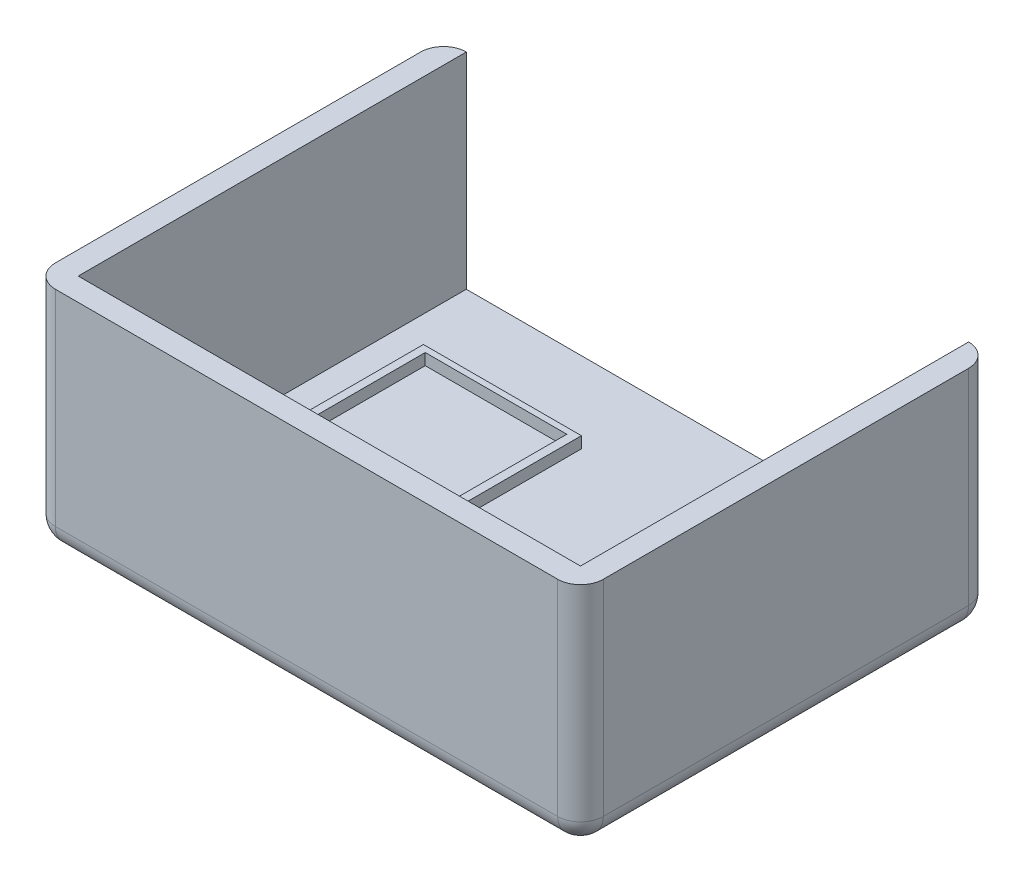
ISO-10303-21;
HEADER;
FILE_DESCRIPTION(('STEP AP214'),'2;1');
FILE_NAME('part.step','',(''),(''),'','','');
FILE_SCHEMA(('AUTOMOTIVE_DESIGN { 1 0 10303 214 1 1 1 1 }'));
ENDSEC;
DATA;
#1=APPLICATION_CONTEXT('core data for automotive mechanical design processes');
#2=APPLICATION_PROTOCOL_DEFINITION('international standard','automotive_design',2000,#1);
#3=PRODUCT_CONTEXT('',#1,'mechanical');
#4=PRODUCT('Part','Part','',(#3));
#5=PRODUCT_RELATED_PRODUCT_CATEGORY('part','',(#4));
#6=PRODUCT_DEFINITION_FORMATION('','',#4);
#7=PRODUCT_DEFINITION_CONTEXT('part definition',#1,'design');
#8=PRODUCT_DEFINITION('design','',#6,#7);
#9=PRODUCT_DEFINITION_SHAPE('','',#8);
#10=(LENGTH_UNIT() NAMED_UNIT(*) SI_UNIT(.MILLI.,.METRE.));
#11=(NAMED_UNIT(*) PLANE_ANGLE_UNIT() SI_UNIT($,.RADIAN.));
#12=(NAMED_UNIT(*) SI_UNIT($,.STERADIAN.) SOLID_ANGLE_UNIT());
#13=UNCERTAINTY_MEASURE_WITH_UNIT(LENGTH_MEASURE(1.E-05),#10,'distance_accuracy_value','');
#14=(GEOMETRIC_REPRESENTATION_CONTEXT(3) GLOBAL_UNCERTAINTY_ASSIGNED_CONTEXT((#13)) GLOBAL_UNIT_ASSIGNED_CONTEXT((#10,
#11,#12)) REPRESENTATION_CONTEXT('',''));
#15=CARTESIAN_POINT('',(0.,0.,0.));
#16=DIRECTION('',(0.,0.,1.));
#17=DIRECTION('',(1.,0.,0.));
#18=AXIS2_PLACEMENT_3D('',#15,#16,#17);
#19=CARTESIAN_POINT('',(0.,10.,0.));
#20=DIRECTION('',(0.,1.,0.));
#21=DIRECTION('',(0.,0.,1.));
#22=AXIS2_PLACEMENT_3D('',#19,#20,#21);
#23=PLANE('',#22);
#24=DIRECTION('',(1.,0.,0.));
#25=VECTOR('',#24,1.);
#26=CARTESIAN_POINT('',(-2.40293783851164,10.,114.360007857852));
#27=LINE('',#26,#25);
#28=CARTESIAN_POINT('',(-2.40293783851164,10.,114.360007857852));
#29=VERTEX_POINT('',#28);
#30=CARTESIAN_POINT('',(66.8037478928062,10.,114.360007857852));
#31=VERTEX_POINT('',#30);
#32=EDGE_CURVE('E379',#29,#31,#27,.T.);
#33=ORIENTED_EDGE('',*,*,#32,.F.);
#34=DIRECTION('',(0.,0.,1.));
#35=VECTOR('',#34,1.);
#36=CARTESIAN_POINT('',(-2.40293783851164,10.,16.4325475480373));
#37=LINE('',#36,#35);
#38=CARTESIAN_POINT('',(-2.40293783851164,10.,16.4325475480373));
#39=VERTEX_POINT('',#38);
#40=EDGE_CURVE('E360',#39,#29,#37,.T.);
#41=ORIENTED_EDGE('',*,*,#40,.F.);
#42=DIRECTION('',(-1.,0.,0.));
#43=VECTOR('',#42,1.);
#44=CARTESIAN_POINT('',(-2.40293783851164,10.,16.4325475480373));
#45=LINE('',#44,#43);
#46=CARTESIAN_POINT('',(66.8037478928062,10.,16.4325475480373));
#47=VERTEX_POINT('',#46);
#48=EDGE_CURVE('E366',#47,#39,#45,.T.);
#49=ORIENTED_EDGE('',*,*,#48,.F.);
#50=DIRECTION('',(0.,0.,-1.));
#51=VECTOR('',#50,1.);
#52=CARTESIAN_POINT('',(66.8037478928062,10.,16.4325475480373));
#53=LINE('',#52,#51);
#54=EDGE_CURVE('E382',#31,#47,#53,.T.);
#55=ORIENTED_EDGE('',*,*,#54,.F.);
#56=EDGE_LOOP('',(#33,#41,#49,#55));
#57=FACE_BOUND('',#56,.T.);
#58=DIRECTION('',(0.,0.,1.));
#59=VECTOR('',#58,1.);
#60=CARTESIAN_POINT('',(-18.954802259887,9.99999999999999,-18.9265536723164));
#61=LINE('',#60,#59);
#62=CARTESIAN_POINT('',(-18.954802259887,9.99999999999999,-18.9265536723164));
#63=VERTEX_POINT('',#62);
#64=CARTESIAN_POINT('',(-18.954802259887,10.,151.073446327684));
#65=VERTEX_POINT('',#64);
#66=EDGE_CURVE('E402',#63,#65,#61,.T.);
#67=ORIENTED_EDGE('',*,*,#66,.T.);
#68=DIRECTION('',(1.,0.,0.));
#69=VECTOR('',#68,1.);
#70=CARTESIAN_POINT('',(-28.954802259887,9.99999999999999,151.073446327684));
#71=LINE('',#70,#69);
#72=CARTESIAN_POINT('',(201.045197740113,10.,151.073446327684));
#73=VERTEX_POINT('',#72);
#74=EDGE_CURVE('E406',#65,#73,#71,.T.);
#75=ORIENTED_EDGE('',*,*,#74,.T.);
#76=DIRECTION('',(0.,0.,1.));
#77=VECTOR('',#76,1.);
#78=CARTESIAN_POINT('',(201.045197740113,9.99999999999999,-18.9265536723164));
#79=LINE('',#78,#77);
#80=CARTESIAN_POINT('',(201.045197740113,9.99999999999999,-18.9265536723164));
#81=VERTEX_POINT('',#80);
#82=EDGE_CURVE('E416',#81,#73,#79,.T.);
#83=ORIENTED_EDGE('',*,*,#82,.F.);
#84=DIRECTION('',(1.,0.,0.));
#85=VECTOR('',#84,1.);
#86=CARTESIAN_POINT('',(-18.954802259887,10.,-18.9265536723164));
#87=LINE('',#86,#85);
#88=EDGE_CURVE('E502',#81,#63,#87,.F.);
#89=ORIENTED_EDGE('',*,*,#88,.T.);
#90=EDGE_LOOP('',(#67,#75,#83,#89));
#91=FACE_BOUND('',#90,.T.);
#92=DIRECTION('',(1.,0.,0.));
#93=VECTOR('',#92,1.);
#94=CARTESIAN_POINT('',(110.403959903536,10.,123.70291043158));
#95=LINE('',#94,#93);
#96=CARTESIAN_POINT('',(110.403959903536,10.,123.70291043158));
#97=VERTEX_POINT('',#96);
#98=CARTESIAN_POINT('',(194.836116495744,10.,123.70291043158));
#99=VERTEX_POINT('',#98);
#100=EDGE_CURVE('E299',#97,#99,#95,.T.);
#101=ORIENTED_EDGE('',*,*,#100,.F.);
#102=DIRECTION('',(0.,0.,1.));
#103=VECTOR('',#102,1.);
#104=CARTESIAN_POINT('',(110.403959903536,10.,73.1820298477179));
#105=LINE('',#104,#103);
#106=CARTESIAN_POINT('',(110.403959903536,10.,73.1820298477179));
#107=VERTEX_POINT('',#106);
#108=EDGE_CURVE('E249',#107,#97,#105,.T.);
#109=ORIENTED_EDGE('',*,*,#108,.F.);
#110=DIRECTION('',(-1.,0.,0.));
#111=VECTOR('',#110,1.);
#112=CARTESIAN_POINT('',(110.403959903536,10.,73.1820298477179));
#113=LINE('',#112,#111);
#114=CARTESIAN_POINT('',(194.836116495744,10.,73.1820298477179));
#115=VERTEX_POINT('',#114);
#116=EDGE_CURVE('E286',#115,#107,#113,.T.);
#117=ORIENTED_EDGE('',*,*,#116,.F.);
#118=DIRECTION('',(0.,0.,-1.));
#119=VECTOR('',#118,1.);
#120=CARTESIAN_POINT('',(194.836116495744,10.,73.1820298477179));
#121=LINE('',#120,#119);
#122=EDGE_CURVE('E302',#99,#115,#121,.T.);
#123=ORIENTED_EDGE('',*,*,#122,.F.);
#124=EDGE_LOOP('',(#101,#109,#117,#123));
#125=FACE_BOUND('',#124,.T.);
#126=ADVANCED_FACE('F41',(#57,#91,#125),#23,.T.);
#127=CARTESIAN_POINT('',(-28.954802259887,100.,-18.9265536723164));
#128=DIRECTION('',(1.,0.,0.));
#129=DIRECTION('',(0.,0.,-1.));
#130=AXIS2_PLACEMENT_3D('',#127,#128,#129);
#131=PLANE('',#130);
#132=DIRECTION('',(0.,-1.,0.));
#133=VECTOR('',#132,1.);
#134=CARTESIAN_POINT('',(-28.954802259887,0.,-8.92655367231638));
#135=LINE('',#134,#133);
#136=CARTESIAN_POINT('',(-28.954802259887,100.,-8.92655367231638));
#137=VERTEX_POINT('',#136);
#138=CARTESIAN_POINT('',(-28.954802259887,9.99999999999999,-8.92655367231638));
#139=VERTEX_POINT('',#138);
#140=EDGE_CURVE('E446',#137,#139,#135,.T.);
#141=ORIENTED_EDGE('',*,*,#140,.T.);
#142=DIRECTION('',(0.,0.,1.));
#143=VECTOR('',#142,1.);
#144=CARTESIAN_POINT('',(-28.954802259887,9.99999999999999,-18.9265536723164));
#145=LINE('',#144,#143);
#146=CARTESIAN_POINT('',(-28.954802259887,9.99999999999999,151.073446327684));
#147=VERTEX_POINT('',#146);
#148=EDGE_CURVE('E509',#139,#147,#145,.T.);
#149=ORIENTED_EDGE('',*,*,#148,.T.);
#150=DIRECTION('',(0.,-1.,0.));
#151=VECTOR('',#150,1.);
#152=CARTESIAN_POINT('',(-28.954802259887,100.,151.073446327684));
#153=LINE('',#152,#151);
#154=CARTESIAN_POINT('',(-28.954802259887,100.,151.073446327684));
#155=VERTEX_POINT('',#154);
#156=EDGE_CURVE('E443',#147,#155,#153,.F.);
#157=ORIENTED_EDGE('',*,*,#156,.T.);
#158=DIRECTION('',(0.,0.,1.));
#159=VECTOR('',#158,1.);
#160=CARTESIAN_POINT('',(-28.954802259887,100.,-18.9265536723164));
#161=LINE('',#160,#159);
#162=EDGE_CURVE('E411',#137,#155,#161,.T.);
#163=ORIENTED_EDGE('',*,*,#162,.F.);
#164=EDGE_LOOP('',(#141,#149,#157,#163));
#165=FACE_BOUND('',#164,.T.);
#166=ADVANCED_FACE('F617',(#165),#131,.F.);
#167=CARTESIAN_POINT('',(-28.954802259887,100.,161.073446327684));
#168=DIRECTION('',(0.,0.,-1.));
#169=DIRECTION('',(-1.,0.,0.));
#170=AXIS2_PLACEMENT_3D('',#167,#168,#169);
#171=PLANE('',#170);
#172=DIRECTION('',(0.,-1.,0.));
#173=VECTOR('',#172,1.);
#174=CARTESIAN_POINT('',(-18.954802259887,100.,161.073446327684));
#175=LINE('',#174,#173);
#176=CARTESIAN_POINT('',(-18.954802259887,100.,161.073446327684));
#177=VERTEX_POINT('',#176);
#178=CARTESIAN_POINT('',(-18.954802259887,9.99999999999999,161.073446327684));
#179=VERTEX_POINT('',#178);
#180=EDGE_CURVE('E474',#177,#179,#175,.T.);
#181=ORIENTED_EDGE('',*,*,#180,.T.);
#182=DIRECTION('',(1.,0.,0.));
#183=VECTOR('',#182,1.);
#184=CARTESIAN_POINT('',(-28.954802259887,9.99999999999999,161.073446327684));
#185=LINE('',#184,#183);
#186=CARTESIAN_POINT('',(201.045197740113,9.99999999999999,161.073446327684));
#187=VERTEX_POINT('',#186);
#188=EDGE_CURVE('E515',#179,#187,#185,.T.);
#189=ORIENTED_EDGE('',*,*,#188,.T.);
#190=DIRECTION('',(0.,-1.,0.));
#191=VECTOR('',#190,1.);
#192=CARTESIAN_POINT('',(201.045197740113,100.,161.073446327684));
#193=LINE('',#192,#191);
#194=CARTESIAN_POINT('',(201.045197740113,100.,161.073446327684));
#195=VERTEX_POINT('',#194);
#196=EDGE_CURVE('E471',#187,#195,#193,.F.);
#197=ORIENTED_EDGE('',*,*,#196,.T.);
#198=DIRECTION('',(1.,0.,0.));
#199=VECTOR('',#198,1.);
#200=CARTESIAN_POINT('',(-28.954802259887,100.,161.073446327684));
#201=LINE('',#200,#199);
#202=EDGE_CURVE('E435',#177,#195,#201,.T.);
#203=ORIENTED_EDGE('',*,*,#202,.F.);
#204=EDGE_LOOP('',(#181,#189,#197,#203));
#205=FACE_BOUND('',#204,.T.);
#206=ADVANCED_FACE('F565',(#205),#171,.F.);
#207=CARTESIAN_POINT('',(211.045197740113,100.,-18.9265536723164));
#208=DIRECTION('',(1.,0.,0.));
#209=DIRECTION('',(0.,0.,-1.));
#210=AXIS2_PLACEMENT_3D('',#207,#208,#209);
#211=PLANE('',#210);
#212=DIRECTION('',(0.,-1.,0.));
#213=VECTOR('',#212,1.);
#214=CARTESIAN_POINT('',(211.045197740113,0.,151.073446327684));
#215=LINE('',#214,#213);
#216=CARTESIAN_POINT('',(211.045197740113,100.,151.073446327684));
#217=VERTEX_POINT('',#216);
#218=CARTESIAN_POINT('',(211.045197740113,10.,151.073446327684));
#219=VERTEX_POINT('',#218);
#220=EDGE_CURVE('E478',#217,#219,#215,.T.);
#221=ORIENTED_EDGE('',*,*,#220,.T.);
#222=DIRECTION('',(0.,0.,1.));
#223=VECTOR('',#222,1.);
#224=CARTESIAN_POINT('',(211.045197740113,10.,-8.92655367231638));
#225=LINE('',#224,#223);
#226=CARTESIAN_POINT('',(211.045197740113,9.99999999999999,-8.92655367231638));
#227=VERTEX_POINT('',#226);
#228=EDGE_CURVE('E11',#219,#227,#225,.F.);
#229=ORIENTED_EDGE('',*,*,#228,.T.);
#230=DIRECTION('',(0.,-1.,0.));
#231=VECTOR('',#230,1.);
#232=CARTESIAN_POINT('',(211.045197740113,100.,-8.92655367231638));
#233=LINE('',#232,#231);
#234=CARTESIAN_POINT('',(211.045197740113,100.,-8.92655367231638));
#235=VERTEX_POINT('',#234);
#236=EDGE_CURVE('E482',#227,#235,#233,.F.);
#237=ORIENTED_EDGE('',*,*,#236,.T.);
#238=DIRECTION('',(0.,0.,1.));
#239=VECTOR('',#238,1.);
#240=CARTESIAN_POINT('',(211.045197740113,100.,-18.9265536723164));
#241=LINE('',#240,#239);
#242=EDGE_CURVE('E439',#235,#217,#241,.T.);
#243=ORIENTED_EDGE('',*,*,#242,.T.);
#244=EDGE_LOOP('',(#221,#229,#237,#243));
#245=FACE_BOUND('',#244,.T.);
#246=ADVANCED_FACE('F578',(#245),#211,.T.);
#247=CARTESIAN_POINT('',(0.,100.,0.));
#248=DIRECTION('',(0.,1.,0.));
#249=DIRECTION('',(0.,0.,1.));
#250=AXIS2_PLACEMENT_3D('',#247,#248,#249);
#251=PLANE('',#250);
#252=CARTESIAN_POINT('',(201.045197740113,100.,-8.92655367231638));
#253=DIRECTION('',(0.,1.,0.));
#254=DIRECTION('',(0.,0.,1.));
#255=AXIS2_PLACEMENT_3D('',#252,#253,#254);
#256=CIRCLE('',#255,10.);
#257=CARTESIAN_POINT('',(201.045197740113,100.,-18.9265536723164));
#258=VERTEX_POINT('',#257);
#259=EDGE_CURVE('E461',#235,#258,#256,.T.);
#260=ORIENTED_EDGE('',*,*,#259,.T.);
#261=DIRECTION('',(0.,0.,1.));
#262=VECTOR('',#261,1.);
#263=CARTESIAN_POINT('',(201.045197740113,100.,-18.9265536723164));
#264=LINE('',#263,#262);
#265=CARTESIAN_POINT('',(201.045197740113,100.,151.073446327684));
#266=VERTEX_POINT('',#265);
#267=EDGE_CURVE('E419',#258,#266,#264,.T.);
#268=ORIENTED_EDGE('',*,*,#267,.T.);
#269=DIRECTION('',(1.,0.,0.));
#270=VECTOR('',#269,1.);
#271=CARTESIAN_POINT('',(-28.954802259887,100.,151.073446327684));
#272=LINE('',#271,#270);
#273=CARTESIAN_POINT('',(-18.954802259887,100.,151.073446327684));
#274=VERTEX_POINT('',#273);
#275=EDGE_CURVE('E426',#274,#266,#272,.T.);
#276=ORIENTED_EDGE('',*,*,#275,.F.);
#277=DIRECTION('',(0.,0.,1.));
#278=VECTOR('',#277,1.);
#279=CARTESIAN_POINT('',(-18.954802259887,100.,-18.9265536723164));
#280=LINE('',#279,#278);
#281=CARTESIAN_POINT('',(-18.954802259887,100.,-18.9265536723164));
#282=VERTEX_POINT('',#281);
#283=EDGE_CURVE('E423',#282,#274,#280,.T.);
#284=ORIENTED_EDGE('',*,*,#283,.F.);
#285=CARTESIAN_POINT('',(-18.954802259887,100.,-8.92655367231638));
#286=DIRECTION('',(0.,1.,0.));
#287=DIRECTION('',(0.,0.,1.));
#288=AXIS2_PLACEMENT_3D('',#285,#286,#287);
#289=CIRCLE('',#288,10.);
#290=EDGE_CURVE('E468',#282,#137,#289,.T.);
#291=ORIENTED_EDGE('',*,*,#290,.T.);
#292=ORIENTED_EDGE('',*,*,#162,.T.);
#293=CARTESIAN_POINT('',(-18.954802259887,100.,151.073446327684));
#294=DIRECTION('',(0.,1.,0.));
#295=DIRECTION('',(0.,0.,1.));
#296=AXIS2_PLACEMENT_3D('',#293,#294,#295);
#297=CIRCLE('',#296,10.);
#298=EDGE_CURVE('E465',#155,#177,#297,.T.);
#299=ORIENTED_EDGE('',*,*,#298,.T.);
#300=ORIENTED_EDGE('',*,*,#202,.T.);
#301=CARTESIAN_POINT('',(201.045197740113,100.,151.073446327684));
#302=DIRECTION('',(0.,1.,0.));
#303=DIRECTION('',(0.,0.,1.));
#304=AXIS2_PLACEMENT_3D('',#301,#302,#303);
#305=CIRCLE('',#304,10.);
#306=EDGE_CURVE('E458',#195,#217,#305,.T.);
#307=ORIENTED_EDGE('',*,*,#306,.T.);
#308=ORIENTED_EDGE('',*,*,#242,.F.);
#309=EDGE_LOOP('',(#260,#268,#276,#284,#291,#292,#299,#300,#307,#308));
#310=FACE_BOUND('',#309,.T.);
#311=ADVANCED_FACE('F569',(#310),#251,.T.);
#312=CARTESIAN_POINT('',(0.,0.,0.));
#313=DIRECTION('',(0.,1.,0.));
#314=DIRECTION('',(0.,0.,1.));
#315=AXIS2_PLACEMENT_3D('',#312,#313,#314);
#316=PLANE('',#315);
#317=DIRECTION('',(0.,0.,1.));
#318=VECTOR('',#317,1.);
#319=CARTESIAN_POINT('',(-18.954802259887,0.,0.));
#320=LINE('',#319,#318);
#321=CARTESIAN_POINT('',(-18.954802259887,0.,151.073446327684));
#322=VERTEX_POINT('',#321);
#323=CARTESIAN_POINT('',(-18.954802259887,0.,-8.92655367231638));
#324=VERTEX_POINT('',#323);
#325=EDGE_CURVE('E495',#322,#324,#320,.F.);
#326=ORIENTED_EDGE('',*,*,#325,.T.);
#327=DIRECTION('',(1.,0.,0.));
#328=VECTOR('',#327,1.);
#329=CARTESIAN_POINT('',(201.045197740113,0.,-8.92655367231638));
#330=LINE('',#329,#328);
#331=CARTESIAN_POINT('',(201.045197740113,0.,-8.92655367231638));
#332=VERTEX_POINT('',#331);
#333=EDGE_CURVE('E498',#324,#332,#330,.T.);
#334=ORIENTED_EDGE('',*,*,#333,.T.);
#335=DIRECTION('',(0.,0.,1.));
#336=VECTOR('',#335,1.);
#337=CARTESIAN_POINT('',(201.045197740113,0.,151.073446327684));
#338=LINE('',#337,#336);
#339=CARTESIAN_POINT('',(201.045197740113,0.,151.073446327684));
#340=VERTEX_POINT('',#339);
#341=EDGE_CURVE('E489',#332,#340,#338,.T.);
#342=ORIENTED_EDGE('',*,*,#341,.T.);
#343=DIRECTION('',(1.,0.,0.));
#344=VECTOR('',#343,1.);
#345=CARTESIAN_POINT('',(0.,0.,151.073446327684));
#346=LINE('',#345,#344);
#347=EDGE_CURVE('E492',#340,#322,#346,.F.);
#348=ORIENTED_EDGE('',*,*,#347,.T.);
#349=EDGE_LOOP('',(#326,#334,#342,#348));
#350=FACE_BOUND('',#349,.T.);
#351=ADVANCED_FACE('F707',(#350),#316,.F.);
#352=CARTESIAN_POINT('',(-18.954802259887,100.,-18.9265536723164));
#353=DIRECTION('',(1.,0.,0.));
#354=DIRECTION('',(0.,0.,-1.));
#355=AXIS2_PLACEMENT_3D('',#352,#353,#354);
#356=PLANE('',#355);
#357=ORIENTED_EDGE('',*,*,#66,.F.);
#358=DIRECTION('',(0.,-1.,0.));
#359=VECTOR('',#358,1.);
#360=CARTESIAN_POINT('',(-18.954802259887,100.,-18.9265536723164));
#361=LINE('',#360,#359);
#362=EDGE_CURVE('E454',#63,#282,#361,.F.);
#363=ORIENTED_EDGE('',*,*,#362,.T.);
#364=ORIENTED_EDGE('',*,*,#283,.T.);
#365=DIRECTION('',(0.,-1.,0.));
#366=VECTOR('',#365,1.);
#367=CARTESIAN_POINT('',(-18.954802259887,100.,151.073446327684));
#368=LINE('',#367,#366);
#369=EDGE_CURVE('E407',#274,#65,#368,.T.);
#370=ORIENTED_EDGE('',*,*,#369,.T.);
#371=EDGE_LOOP('',(#357,#363,#364,#370));
#372=FACE_BOUND('',#371,.T.);
#373=ADVANCED_FACE('F611',(#372),#356,.T.);
#374=CARTESIAN_POINT('',(-28.954802259887,100.,151.073446327684));
#375=DIRECTION('',(0.,0.,-1.));
#376=DIRECTION('',(-1.,0.,0.));
#377=AXIS2_PLACEMENT_3D('',#374,#375,#376);
#378=PLANE('',#377);
#379=ORIENTED_EDGE('',*,*,#74,.F.);
#380=ORIENTED_EDGE('',*,*,#369,.F.);
#381=ORIENTED_EDGE('',*,*,#275,.T.);
#382=DIRECTION('',(0.,-1.,0.));
#383=VECTOR('',#382,1.);
#384=CARTESIAN_POINT('',(201.045197740113,100.,151.073446327684));
#385=LINE('',#384,#383);
#386=EDGE_CURVE('E412',#266,#73,#385,.T.);
#387=ORIENTED_EDGE('',*,*,#386,.T.);
#388=EDGE_LOOP('',(#379,#380,#381,#387));
#389=FACE_BOUND('',#388,.T.);
#390=ADVANCED_FACE('F607',(#389),#378,.T.);
#391=CARTESIAN_POINT('',(201.045197740113,100.,-18.9265536723164));
#392=DIRECTION('',(1.,0.,0.));
#393=DIRECTION('',(0.,0.,-1.));
#394=AXIS2_PLACEMENT_3D('',#391,#392,#393);
#395=PLANE('',#394);
#396=ORIENTED_EDGE('',*,*,#82,.T.);
#397=ORIENTED_EDGE('',*,*,#386,.F.);
#398=ORIENTED_EDGE('',*,*,#267,.F.);
#399=DIRECTION('',(0.,-1.,0.));
#400=VECTOR('',#399,1.);
#401=CARTESIAN_POINT('',(201.045197740113,100.,-18.9265536723164));
#402=LINE('',#401,#400);
#403=EDGE_CURVE('E450',#258,#81,#402,.T.);
#404=ORIENTED_EDGE('',*,*,#403,.T.);
#405=EDGE_LOOP('',(#396,#397,#398,#404));
#406=FACE_BOUND('',#405,.T.);
#407=ADVANCED_FACE('F605',(#406),#395,.F.);
#408=CARTESIAN_POINT('',(-18.954802259887,100.,-8.92655367231638));
#409=DIRECTION('',(0.,1.,0.));
#410=DIRECTION('',(0.,0.,1.));
#411=AXIS2_PLACEMENT_3D('',#408,#409,#410);
#412=CYLINDRICAL_SURFACE('',#411,10.);
#413=ORIENTED_EDGE('',*,*,#362,.F.);
#414=CARTESIAN_POINT('',(-18.954802259887,9.99999999999999,-8.92655367231638));
#415=DIRECTION('',(0.,1.,0.));
#416=DIRECTION('',(0.,0.,1.));
#417=AXIS2_PLACEMENT_3D('',#414,#415,#416);
#418=CIRCLE('',#417,10.);
#419=EDGE_CURVE('E506',#63,#139,#418,.T.);
#420=ORIENTED_EDGE('',*,*,#419,.T.);
#421=ORIENTED_EDGE('',*,*,#140,.F.);
#422=ORIENTED_EDGE('',*,*,#290,.F.);
#423=EDGE_LOOP('',(#413,#420,#421,#422));
#424=FACE_BOUND('',#423,.T.);
#425=ADVANCED_FACE('F618',(#424),#412,.T.);
#426=CARTESIAN_POINT('',(-18.954802259887,100.,151.073446327684));
#427=DIRECTION('',(0.,-1.,0.));
#428=DIRECTION('',(0.,0.,-1.));
#429=AXIS2_PLACEMENT_3D('',#426,#427,#428);
#430=CYLINDRICAL_SURFACE('',#429,10.);
#431=ORIENTED_EDGE('',*,*,#156,.F.);
#432=CARTESIAN_POINT('',(-18.954802259887,9.99999999999999,151.073446327684));
#433=DIRECTION('',(0.,-1.,0.));
#434=DIRECTION('',(0.,0.,-1.));
#435=AXIS2_PLACEMENT_3D('',#432,#433,#434);
#436=CIRCLE('',#435,10.);
#437=EDGE_CURVE('E512',#147,#179,#436,.F.);
#438=ORIENTED_EDGE('',*,*,#437,.T.);
#439=ORIENTED_EDGE('',*,*,#180,.F.);
#440=ORIENTED_EDGE('',*,*,#298,.F.);
#441=EDGE_LOOP('',(#431,#438,#439,#440));
#442=FACE_BOUND('',#441,.T.);
#443=ADVANCED_FACE('F561',(#442),#430,.T.);
#444=CARTESIAN_POINT('',(201.045197740113,100.,-8.92655367231638));
#445=DIRECTION('',(0.,-1.,0.));
#446=DIRECTION('',(0.,0.,-1.));
#447=AXIS2_PLACEMENT_3D('',#444,#445,#446);
#448=CYLINDRICAL_SURFACE('',#447,10.);
#449=ORIENTED_EDGE('',*,*,#236,.F.);
#450=CARTESIAN_POINT('',(201.045197740113,9.99999999999999,-8.92655367231638));
#451=DIRECTION('',(0.,-1.,0.));
#452=DIRECTION('',(0.,0.,-1.));
#453=AXIS2_PLACEMENT_3D('',#450,#451,#452);
#454=CIRCLE('',#453,10.);
#455=EDGE_CURVE('E485',#227,#81,#454,.F.);
#456=ORIENTED_EDGE('',*,*,#455,.T.);
#457=ORIENTED_EDGE('',*,*,#403,.F.);
#458=ORIENTED_EDGE('',*,*,#259,.F.);
#459=EDGE_LOOP('',(#449,#456,#457,#458));
#460=FACE_BOUND('',#459,.T.);
#461=ADVANCED_FACE('F600',(#460),#448,.T.);
#462=CARTESIAN_POINT('',(201.045197740113,100.,151.073446327684));
#463=DIRECTION('',(0.,1.,0.));
#464=DIRECTION('',(0.,0.,1.));
#465=AXIS2_PLACEMENT_3D('',#462,#463,#464);
#466=CYLINDRICAL_SURFACE('',#465,10.);
#467=ORIENTED_EDGE('',*,*,#196,.F.);
#468=CARTESIAN_POINT('',(201.045197740113,9.99999999999999,151.073446327684));
#469=DIRECTION('',(0.,1.,0.));
#470=DIRECTION('',(0.,0.,1.));
#471=AXIS2_PLACEMENT_3D('',#468,#469,#470);
#472=CIRCLE('',#471,10.);
#473=EDGE_CURVE('E51',#187,#219,#472,.T.);
#474=ORIENTED_EDGE('',*,*,#473,.T.);
#475=ORIENTED_EDGE('',*,*,#220,.F.);
#476=ORIENTED_EDGE('',*,*,#306,.F.);
#477=EDGE_LOOP('',(#467,#474,#475,#476));
#478=FACE_BOUND('',#477,.T.);
#479=ADVANCED_FACE('F573',(#478),#466,.T.);
#480=CARTESIAN_POINT('',(-18.954802259887,9.99999999999999,151.073446327684));
#481=DIRECTION('',(0.,1.,0.));
#482=DIRECTION('',(0.,0.,1.));
#483=AXIS2_PLACEMENT_3D('',#480,#481,#482);
#484=SPHERICAL_SURFACE('',#483,10.);
#485=CARTESIAN_POINT('',(-18.954802259887,9.99999999999999,151.073446327684));
#486=DIRECTION('',(1.,0.,0.));
#487=DIRECTION('',(0.,0.,-1.));
#488=AXIS2_PLACEMENT_3D('',#485,#486,#487);
#489=CIRCLE('',#488,10.);
#490=EDGE_CURVE('E541',#179,#322,#489,.T.);
#491=ORIENTED_EDGE('',*,*,#490,.F.);
#492=ORIENTED_EDGE('',*,*,#437,.F.);
#493=CARTESIAN_POINT('',(-18.954802259887,10.,151.073446327684));
#494=DIRECTION('',(0.,0.,-1.));
#495=DIRECTION('',(-1.,0.,0.));
#496=AXIS2_PLACEMENT_3D('',#493,#494,#495);
#497=CIRCLE('',#496,10.);
#498=EDGE_CURVE('E45',#322,#147,#497,.T.);
#499=ORIENTED_EDGE('',*,*,#498,.F.);
#500=EDGE_LOOP('',(#491,#492,#499));
#501=FACE_BOUND('',#500,.T.);
#502=ADVANCED_FACE('F43',(#501),#484,.T.);
#503=CARTESIAN_POINT('',(-18.954802259887,9.99999999999999,-18.9265536723164));
#504=DIRECTION('',(0.,0.,1.));
#505=DIRECTION('',(1.,0.,0.));
#506=AXIS2_PLACEMENT_3D('',#503,#504,#505);
#507=CYLINDRICAL_SURFACE('',#506,10.);
#508=ORIENTED_EDGE('',*,*,#498,.T.);
#509=ORIENTED_EDGE('',*,*,#148,.F.);
#510=CARTESIAN_POINT('',(-18.954802259887,10.,-8.92655367231638));
#511=DIRECTION('',(0.,0.,-1.));
#512=DIRECTION('',(-1.,0.,0.));
#513=AXIS2_PLACEMENT_3D('',#510,#511,#512);
#514=CIRCLE('',#513,10.);
#515=EDGE_CURVE('E538',#324,#139,#514,.T.);
#516=ORIENTED_EDGE('',*,*,#515,.F.);
#517=ORIENTED_EDGE('',*,*,#325,.F.);
#518=EDGE_LOOP('',(#508,#509,#516,#517));
#519=FACE_BOUND('',#518,.T.);
#520=ADVANCED_FACE('F554',(#519),#507,.T.);
#521=CARTESIAN_POINT('',(-28.954802259887,9.99999999999999,151.073446327684));
#522=DIRECTION('',(1.,0.,0.));
#523=DIRECTION('',(0.,0.,-1.));
#524=AXIS2_PLACEMENT_3D('',#521,#522,#523);
#525=CYLINDRICAL_SURFACE('',#524,10.);
#526=ORIENTED_EDGE('',*,*,#490,.T.);
#527=ORIENTED_EDGE('',*,*,#347,.F.);
#528=CARTESIAN_POINT('',(201.045197740113,9.99999999999999,151.073446327684));
#529=DIRECTION('',(1.,0.,0.));
#530=DIRECTION('',(0.,0.,-1.));
#531=AXIS2_PLACEMENT_3D('',#528,#529,#530);
#532=CIRCLE('',#531,10.);
#533=EDGE_CURVE('E534',#187,#340,#532,.T.);
#534=ORIENTED_EDGE('',*,*,#533,.F.);
#535=ORIENTED_EDGE('',*,*,#188,.F.);
#536=EDGE_LOOP('',(#526,#527,#534,#535));
#537=FACE_BOUND('',#536,.T.);
#538=ADVANCED_FACE('F623',(#537),#525,.T.);
#539=CARTESIAN_POINT('',(-18.954802259887,9.99999999999999,-8.92655367231638));
#540=DIRECTION('',(0.,1.,0.));
#541=DIRECTION('',(0.,0.,1.));
#542=AXIS2_PLACEMENT_3D('',#539,#540,#541);
#543=SPHERICAL_SURFACE('',#542,10.);
#544=ORIENTED_EDGE('',*,*,#515,.T.);
#545=ORIENTED_EDGE('',*,*,#419,.F.);
#546=CARTESIAN_POINT('',(-18.954802259887,10.,-8.92655367231638));
#547=DIRECTION('',(1.,0.,0.));
#548=DIRECTION('',(0.,0.,-1.));
#549=AXIS2_PLACEMENT_3D('',#546,#547,#548);
#550=CIRCLE('',#549,10.);
#551=EDGE_CURVE('E530',#324,#63,#550,.T.);
#552=ORIENTED_EDGE('',*,*,#551,.F.);
#553=EDGE_LOOP('',(#544,#545,#552));
#554=FACE_BOUND('',#553,.T.);
#555=ADVANCED_FACE('F621',(#554),#543,.T.);
#556=CARTESIAN_POINT('',(201.045197740113,9.99999999999999,151.073446327684));
#557=DIRECTION('',(0.,1.,0.));
#558=DIRECTION('',(0.,0.,1.));
#559=AXIS2_PLACEMENT_3D('',#556,#557,#558);
#560=SPHERICAL_SURFACE('',#559,10.);
#561=ORIENTED_EDGE('',*,*,#473,.F.);
#562=ORIENTED_EDGE('',*,*,#533,.T.);
#563=CARTESIAN_POINT('',(201.045197740113,9.99999999999999,151.073446327684));
#564=DIRECTION('',(0.,0.,-1.));
#565=DIRECTION('',(-1.,0.,0.));
#566=AXIS2_PLACEMENT_3D('',#563,#564,#565);
#567=CIRCLE('',#566,10.);
#568=EDGE_CURVE('E526',#219,#340,#567,.T.);
#569=ORIENTED_EDGE('',*,*,#568,.F.);
#570=EDGE_LOOP('',(#561,#562,#569));
#571=FACE_BOUND('',#570,.T.);
#572=ADVANCED_FACE('F582',(#571),#560,.T.);
#573=CARTESIAN_POINT('',(0.,10.,-8.92655367231638));
#574=DIRECTION('',(-1.,0.,0.));
#575=DIRECTION('',(0.,0.,1.));
#576=AXIS2_PLACEMENT_3D('',#573,#574,#575);
#577=CYLINDRICAL_SURFACE('',#576,10.);
#578=ORIENTED_EDGE('',*,*,#551,.T.);
#579=ORIENTED_EDGE('',*,*,#88,.F.);
#580=CARTESIAN_POINT('',(201.045197740113,10.,-8.92655367231638));
#581=DIRECTION('',(1.,0.,0.));
#582=DIRECTION('',(0.,0.,-1.));
#583=AXIS2_PLACEMENT_3D('',#580,#581,#582);
#584=CIRCLE('',#583,10.);
#585=EDGE_CURVE('E522',#332,#81,#584,.T.);
#586=ORIENTED_EDGE('',*,*,#585,.F.);
#587=ORIENTED_EDGE('',*,*,#333,.F.);
#588=EDGE_LOOP('',(#578,#579,#586,#587));
#589=FACE_BOUND('',#588,.T.);
#590=ADVANCED_FACE('F594',(#589),#577,.T.);
#591=CARTESIAN_POINT('',(201.045197740113,10.,0.));
#592=DIRECTION('',(0.,0.,-1.));
#593=DIRECTION('',(-1.,0.,0.));
#594=AXIS2_PLACEMENT_3D('',#591,#592,#593);
#595=CYLINDRICAL_SURFACE('',#594,10.);
#596=ORIENTED_EDGE('',*,*,#568,.T.);
#597=ORIENTED_EDGE('',*,*,#341,.F.);
#598=CARTESIAN_POINT('',(201.045197740113,10.,-8.92655367231638));
#599=DIRECTION('',(0.,0.,-1.));
#600=DIRECTION('',(-1.,0.,0.));
#601=AXIS2_PLACEMENT_3D('',#598,#599,#600);
#602=CIRCLE('',#601,10.);
#603=EDGE_CURVE('E401',#227,#332,#602,.T.);
#604=ORIENTED_EDGE('',*,*,#603,.F.);
#605=ORIENTED_EDGE('',*,*,#228,.F.);
#606=EDGE_LOOP('',(#596,#597,#604,#605));
#607=FACE_BOUND('',#606,.T.);
#608=ADVANCED_FACE('F586',(#607),#595,.T.);
#609=CARTESIAN_POINT('',(201.045197740113,9.99999999999999,-8.92655367231638));
#610=DIRECTION('',(0.,1.,0.));
#611=DIRECTION('',(0.,0.,1.));
#612=AXIS2_PLACEMENT_3D('',#609,#610,#611);
#613=SPHERICAL_SURFACE('',#612,10.);
#614=ORIENTED_EDGE('',*,*,#585,.T.);
#615=ORIENTED_EDGE('',*,*,#455,.F.);
#616=ORIENTED_EDGE('',*,*,#603,.T.);
#617=EDGE_LOOP('',(#614,#615,#616));
#618=FACE_BOUND('',#617,.T.);
#619=ADVANCED_FACE('F590',(#618),#613,.T.);
#620=CARTESIAN_POINT('',(0.,15.,0.));
#621=DIRECTION('',(0.,1.,0.));
#622=DIRECTION('',(0.,0.,1.));
#623=AXIS2_PLACEMENT_3D('',#620,#621,#622);
#624=PLANE('',#623);
#625=DIRECTION('',(0.,0.,1.));
#626=VECTOR('',#625,1.);
#627=CARTESIAN_POINT('',(-2.40293783851164,15.,16.4325475480373));
#628=LINE('',#627,#626);
#629=CARTESIAN_POINT('',(-2.40293783851164,15.,16.4325475480373));
#630=VERTEX_POINT('',#629);
#631=CARTESIAN_POINT('',(-2.40293783851164,15.,114.360007857852));
#632=VERTEX_POINT('',#631);
#633=EDGE_CURVE('E361',#630,#632,#628,.T.);
#634=ORIENTED_EDGE('',*,*,#633,.T.);
#635=DIRECTION('',(1.,0.,0.));
#636=VECTOR('',#635,1.);
#637=CARTESIAN_POINT('',(-2.40293783851164,15.,114.360007857852));
#638=LINE('',#637,#636);
#639=CARTESIAN_POINT('',(66.8037478928062,15.,114.360007857852));
#640=VERTEX_POINT('',#639);
#641=EDGE_CURVE('E365',#632,#640,#638,.T.);
#642=ORIENTED_EDGE('',*,*,#641,.T.);
#643=DIRECTION('',(0.,0.,-1.));
#644=VECTOR('',#643,1.);
#645=CARTESIAN_POINT('',(66.8037478928062,15.,16.4325475480373));
#646=LINE('',#645,#644);
#647=CARTESIAN_POINT('',(66.8037478928062,15.,16.4325475480373));
#648=VERTEX_POINT('',#647);
#649=EDGE_CURVE('E369',#640,#648,#646,.T.);
#650=ORIENTED_EDGE('',*,*,#649,.T.);
#651=DIRECTION('',(-1.,0.,0.));
#652=VECTOR('',#651,1.);
#653=CARTESIAN_POINT('',(-2.40293783851164,15.,16.4325475480373));
#654=LINE('',#653,#652);
#655=EDGE_CURVE('E372',#648,#630,#654,.T.);
#656=ORIENTED_EDGE('',*,*,#655,.T.);
#657=EDGE_LOOP('',(#634,#642,#650,#656));
#658=FACE_BOUND('',#657,.T.);
#659=DIRECTION('',(1.,0.,0.));
#660=VECTOR('',#659,1.);
#661=CARTESIAN_POINT('',(1.04519774011301,15.,111.073446327684));
#662=LINE('',#661,#660);
#663=CARTESIAN_POINT('',(1.04519774011301,15.,111.073446327684));
#664=VERTEX_POINT('',#663);
#665=CARTESIAN_POINT('',(63.045197740113,15.,111.073446327684));
#666=VERTEX_POINT('',#665);
#667=EDGE_CURVE('E323',#664,#666,#662,.T.);
#668=ORIENTED_EDGE('',*,*,#667,.F.);
#669=DIRECTION('',(0.,0.,1.));
#670=VECTOR('',#669,1.);
#671=CARTESIAN_POINT('',(1.045197740113,15.,19.0734463276836));
#672=LINE('',#671,#670);
#673=CARTESIAN_POINT('',(1.045197740113,15.,19.0734463276836));
#674=VERTEX_POINT('',#673);
#675=EDGE_CURVE('E320',#674,#664,#672,.T.);
#676=ORIENTED_EDGE('',*,*,#675,.F.);
#677=DIRECTION('',(-1.,0.,0.));
#678=VECTOR('',#677,1.);
#679=CARTESIAN_POINT('',(1.045197740113,15.,19.0734463276836));
#680=LINE('',#679,#678);
#681=CARTESIAN_POINT('',(63.045197740113,15.,19.0734463276836));
#682=VERTEX_POINT('',#681);
#683=EDGE_CURVE('E331',#682,#674,#680,.T.);
#684=ORIENTED_EDGE('',*,*,#683,.F.);
#685=DIRECTION('',(0.,0.,-1.));
#686=VECTOR('',#685,1.);
#687=CARTESIAN_POINT('',(63.045197740113,15.,19.0734463276836));
#688=LINE('',#687,#686);
#689=EDGE_CURVE('E327',#666,#682,#688,.T.);
#690=ORIENTED_EDGE('',*,*,#689,.F.);
#691=EDGE_LOOP('',(#668,#676,#684,#690));
#692=FACE_BOUND('',#691,.T.);
#693=ADVANCED_FACE('F673',(#658,#692),#624,.T.);
#694=CARTESIAN_POINT('',(-2.40293783851164,15.,16.4325475480373));
#695=DIRECTION('',(1.,0.,0.));
#696=DIRECTION('',(0.,0.,-1.));
#697=AXIS2_PLACEMENT_3D('',#694,#695,#696);
#698=PLANE('',#697);
#699=ORIENTED_EDGE('',*,*,#40,.T.);
#700=DIRECTION('',(0.,-1.,0.));
#701=VECTOR('',#700,1.);
#702=CARTESIAN_POINT('',(-2.40293783851164,15.,114.360007857852));
#703=LINE('',#702,#701);
#704=EDGE_CURVE('E398',#632,#29,#703,.T.);
#705=ORIENTED_EDGE('',*,*,#704,.F.);
#706=ORIENTED_EDGE('',*,*,#633,.F.);
#707=DIRECTION('',(0.,-1.,0.));
#708=VECTOR('',#707,1.);
#709=CARTESIAN_POINT('',(-2.40293783851164,15.,16.4325475480373));
#710=LINE('',#709,#708);
#711=EDGE_CURVE('E375',#630,#39,#710,.T.);
#712=ORIENTED_EDGE('',*,*,#711,.T.);
#713=EDGE_LOOP('',(#699,#705,#706,#712));
#714=FACE_BOUND('',#713,.T.);
#715=ADVANCED_FACE('F689',(#714),#698,.F.);
#716=CARTESIAN_POINT('',(-2.40293783851164,15.,114.360007857852));
#717=DIRECTION('',(0.,0.,-1.));
#718=DIRECTION('',(-1.,0.,0.));
#719=AXIS2_PLACEMENT_3D('',#716,#717,#718);
#720=PLANE('',#719);
#721=ORIENTED_EDGE('',*,*,#32,.T.);
#722=DIRECTION('',(0.,-1.,0.));
#723=VECTOR('',#722,1.);
#724=CARTESIAN_POINT('',(66.8037478928062,15.,114.360007857852));
#725=LINE('',#724,#723);
#726=EDGE_CURVE('E394',#640,#31,#725,.T.);
#727=ORIENTED_EDGE('',*,*,#726,.F.);
#728=ORIENTED_EDGE('',*,*,#641,.F.);
#729=ORIENTED_EDGE('',*,*,#704,.T.);
#730=EDGE_LOOP('',(#721,#727,#728,#729));
#731=FACE_BOUND('',#730,.T.);
#732=ADVANCED_FACE('F697',(#731),#720,.F.);
#733=CARTESIAN_POINT('',(66.8037478928062,15.,16.4325475480373));
#734=DIRECTION('',(-1.,0.,0.));
#735=DIRECTION('',(0.,0.,1.));
#736=AXIS2_PLACEMENT_3D('',#733,#734,#735);
#737=PLANE('',#736);
#738=ORIENTED_EDGE('',*,*,#54,.T.);
#739=DIRECTION('',(0.,-1.,0.));
#740=VECTOR('',#739,1.);
#741=CARTESIAN_POINT('',(66.8037478928062,15.,16.4325475480373));
#742=LINE('',#741,#740);
#743=EDGE_CURVE('E391',#648,#47,#742,.T.);
#744=ORIENTED_EDGE('',*,*,#743,.F.);
#745=ORIENTED_EDGE('',*,*,#649,.F.);
#746=ORIENTED_EDGE('',*,*,#726,.T.);
#747=EDGE_LOOP('',(#738,#744,#745,#746));
#748=FACE_BOUND('',#747,.T.);
#749=ADVANCED_FACE('F693',(#748),#737,.F.);
#750=CARTESIAN_POINT('',(-2.40293783851164,15.,16.4325475480373));
#751=DIRECTION('',(0.,0.,1.));
#752=DIRECTION('',(1.,0.,0.));
#753=AXIS2_PLACEMENT_3D('',#750,#751,#752);
#754=PLANE('',#753);
#755=ORIENTED_EDGE('',*,*,#48,.T.);
#756=ORIENTED_EDGE('',*,*,#711,.F.);
#757=ORIENTED_EDGE('',*,*,#655,.F.);
#758=ORIENTED_EDGE('',*,*,#743,.T.);
#759=EDGE_LOOP('',(#755,#756,#757,#758));
#760=FACE_BOUND('',#759,.T.);
#761=ADVANCED_FACE('F686',(#760),#754,.F.);
#762=CARTESIAN_POINT('',(1.045197740113,15.,19.0734463276836));
#763=DIRECTION('',(1.,0.,0.));
#764=DIRECTION('',(0.,0.,-1.));
#765=AXIS2_PLACEMENT_3D('',#762,#763,#764);
#766=PLANE('',#765);
#767=DIRECTION('',(0.,0.,1.));
#768=VECTOR('',#767,1.);
#769=CARTESIAN_POINT('',(1.045197740113,10.,19.0734463276836));
#770=LINE('',#769,#768);
#771=CARTESIAN_POINT('',(1.045197740113,10.,19.0734463276836));
#772=VERTEX_POINT('',#771);
#773=CARTESIAN_POINT('',(1.04519774011301,10.,111.073446327684));
#774=VERTEX_POINT('',#773);
#775=EDGE_CURVE('E319',#772,#774,#770,.T.);
#776=ORIENTED_EDGE('',*,*,#775,.F.);
#777=DIRECTION('',(0.,-1.,0.));
#778=VECTOR('',#777,1.);
#779=CARTESIAN_POINT('',(1.045197740113,15.,19.0734463276836));
#780=LINE('',#779,#778);
#781=EDGE_CURVE('E334',#674,#772,#780,.T.);
#782=ORIENTED_EDGE('',*,*,#781,.F.);
#783=ORIENTED_EDGE('',*,*,#675,.T.);
#784=DIRECTION('',(0.,-1.,0.));
#785=VECTOR('',#784,1.);
#786=CARTESIAN_POINT('',(1.04519774011301,15.,111.073446327684));
#787=LINE('',#786,#785);
#788=EDGE_CURVE('E356',#664,#774,#787,.T.);
#789=ORIENTED_EDGE('',*,*,#788,.T.);
#790=EDGE_LOOP('',(#776,#782,#783,#789));
#791=FACE_BOUND('',#790,.T.);
#792=ADVANCED_FACE('F669',(#791),#766,.T.);
#793=CARTESIAN_POINT('',(1.04519774011301,15.,111.073446327684));
#794=DIRECTION('',(0.,0.,-1.));
#795=DIRECTION('',(-1.,0.,0.));
#796=AXIS2_PLACEMENT_3D('',#793,#794,#795);
#797=PLANE('',#796);
#798=DIRECTION('',(1.,0.,0.));
#799=VECTOR('',#798,1.);
#800=CARTESIAN_POINT('',(1.04519774011301,10.,111.073446327684));
#801=LINE('',#800,#799);
#802=CARTESIAN_POINT('',(63.045197740113,10.,111.073446327684));
#803=VERTEX_POINT('',#802);
#804=EDGE_CURVE('E337',#774,#803,#801,.T.);
#805=ORIENTED_EDGE('',*,*,#804,.F.);
#806=ORIENTED_EDGE('',*,*,#788,.F.);
#807=ORIENTED_EDGE('',*,*,#667,.T.);
#808=DIRECTION('',(0.,-1.,0.));
#809=VECTOR('',#808,1.);
#810=CARTESIAN_POINT('',(63.045197740113,15.,111.073446327684));
#811=LINE('',#810,#809);
#812=EDGE_CURVE('E352',#666,#803,#811,.T.);
#813=ORIENTED_EDGE('',*,*,#812,.T.);
#814=EDGE_LOOP('',(#805,#806,#807,#813));
#815=FACE_BOUND('',#814,.T.);
#816=ADVANCED_FACE('F665',(#815),#797,.T.);
#817=CARTESIAN_POINT('',(63.045197740113,15.,19.0734463276836));
#818=DIRECTION('',(-1.,0.,0.));
#819=DIRECTION('',(0.,0.,1.));
#820=AXIS2_PLACEMENT_3D('',#817,#818,#819);
#821=PLANE('',#820);
#822=DIRECTION('',(0.,0.,-1.));
#823=VECTOR('',#822,1.);
#824=CARTESIAN_POINT('',(63.045197740113,10.,19.0734463276836));
#825=LINE('',#824,#823);
#826=CARTESIAN_POINT('',(63.045197740113,10.,19.0734463276836));
#827=VERTEX_POINT('',#826);
#828=EDGE_CURVE('E340',#803,#827,#825,.T.);
#829=ORIENTED_EDGE('',*,*,#828,.F.);
#830=ORIENTED_EDGE('',*,*,#812,.F.);
#831=ORIENTED_EDGE('',*,*,#689,.T.);
#832=DIRECTION('',(0.,-1.,0.));
#833=VECTOR('',#832,1.);
#834=CARTESIAN_POINT('',(63.045197740113,15.,19.0734463276836));
#835=LINE('',#834,#833);
#836=EDGE_CURVE('E348',#682,#827,#835,.T.);
#837=ORIENTED_EDGE('',*,*,#836,.T.);
#838=EDGE_LOOP('',(#829,#830,#831,#837));
#839=FACE_BOUND('',#838,.T.);
#840=ADVANCED_FACE('F655',(#839),#821,.T.);
#841=CARTESIAN_POINT('',(1.045197740113,15.,19.0734463276836));
#842=DIRECTION('',(0.,0.,1.));
#843=DIRECTION('',(1.,0.,0.));
#844=AXIS2_PLACEMENT_3D('',#841,#842,#843);
#845=PLANE('',#844);
#846=DIRECTION('',(-1.,0.,0.));
#847=VECTOR('',#846,1.);
#848=CARTESIAN_POINT('',(1.045197740113,10.,19.0734463276836));
#849=LINE('',#848,#847);
#850=EDGE_CURVE('E324',#827,#772,#849,.T.);
#851=ORIENTED_EDGE('',*,*,#850,.F.);
#852=ORIENTED_EDGE('',*,*,#836,.F.);
#853=ORIENTED_EDGE('',*,*,#683,.T.);
#854=ORIENTED_EDGE('',*,*,#781,.T.);
#855=EDGE_LOOP('',(#851,#852,#853,#854));
#856=FACE_BOUND('',#855,.T.);
#857=ADVANCED_FACE('F646',(#856),#845,.T.);
#858=ORIENTED_EDGE('',*,*,#775,.T.);
#859=ORIENTED_EDGE('',*,*,#804,.T.);
#860=ORIENTED_EDGE('',*,*,#828,.T.);
#861=ORIENTED_EDGE('',*,*,#850,.T.);
#862=EDGE_LOOP('',(#858,#859,#860,#861));
#863=FACE_BOUND('',#862,.T.);
#864=ADVANCED_FACE('F635',(#863),#23,.T.);
#865=CARTESIAN_POINT('',(0.,15.,0.));
#866=DIRECTION('',(0.,1.,0.));
#867=DIRECTION('',(0.,0.,1.));
#868=AXIS2_PLACEMENT_3D('',#865,#866,#867);
#869=PLANE('',#868);
#870=DIRECTION('',(0.,0.,1.));
#871=VECTOR('',#870,1.);
#872=CARTESIAN_POINT('',(110.403959903536,15.,73.1820298477179));
#873=LINE('',#872,#871);
#874=CARTESIAN_POINT('',(110.403959903536,15.,73.1820298477179));
#875=VERTEX_POINT('',#874);
#876=CARTESIAN_POINT('',(110.403959903536,15.,123.70291043158));
#877=VERTEX_POINT('',#876);
#878=EDGE_CURVE('E281',#875,#877,#873,.T.);
#879=ORIENTED_EDGE('',*,*,#878,.T.);
#880=DIRECTION('',(1.,0.,0.));
#881=VECTOR('',#880,1.);
#882=CARTESIAN_POINT('',(110.403959903536,15.,123.70291043158));
#883=LINE('',#882,#881);
#884=CARTESIAN_POINT('',(194.836116495744,15.,123.70291043158));
#885=VERTEX_POINT('',#884);
#886=EDGE_CURVE('E285',#877,#885,#883,.T.);
#887=ORIENTED_EDGE('',*,*,#886,.T.);
#888=DIRECTION('',(0.,0.,-1.));
#889=VECTOR('',#888,1.);
#890=CARTESIAN_POINT('',(194.836116495744,15.,73.1820298477179));
#891=LINE('',#890,#889);
#892=CARTESIAN_POINT('',(194.836116495744,15.,73.1820298477179));
#893=VERTEX_POINT('',#892);
#894=EDGE_CURVE('E289',#885,#893,#891,.T.);
#895=ORIENTED_EDGE('',*,*,#894,.T.);
#896=DIRECTION('',(-1.,0.,0.));
#897=VECTOR('',#896,1.);
#898=CARTESIAN_POINT('',(110.403959903536,15.,73.1820298477179));
#899=LINE('',#898,#897);
#900=EDGE_CURVE('E292',#893,#875,#899,.T.);
#901=ORIENTED_EDGE('',*,*,#900,.T.);
#902=EDGE_LOOP('',(#879,#887,#895,#901));
#903=FACE_BOUND('',#902,.T.);
#904=DIRECTION('',(1.,0.,0.));
#905=VECTOR('',#904,1.);
#906=CARTESIAN_POINT('',(114.556361047416,15.,118.680464420254));
#907=LINE('',#906,#905);
#908=CARTESIAN_POINT('',(114.556361047416,15.,118.680464420254));
#909=VERTEX_POINT('',#908);
#910=CARTESIAN_POINT('',(190.556361047416,15.,118.680464420254));
#911=VERTEX_POINT('',#910);
#912=EDGE_CURVE('E240',#909,#911,#907,.T.);
#913=ORIENTED_EDGE('',*,*,#912,.F.);
#914=DIRECTION('',(0.,0.,1.));
#915=VECTOR('',#914,1.);
#916=CARTESIAN_POINT('',(114.556361047416,15.,77.6804644202536));
#917=LINE('',#916,#915);
#918=CARTESIAN_POINT('',(114.556361047416,15.,77.6804644202536));
#919=VERTEX_POINT('',#918);
#920=EDGE_CURVE('E230',#919,#909,#917,.T.);
#921=ORIENTED_EDGE('',*,*,#920,.F.);
#922=DIRECTION('',(-1.,0.,0.));
#923=VECTOR('',#922,1.);
#924=CARTESIAN_POINT('',(114.556361047416,15.,77.6804644202536));
#925=LINE('',#924,#923);
#926=CARTESIAN_POINT('',(190.556361047416,15.,77.6804644202536));
#927=VERTEX_POINT('',#926);
#928=EDGE_CURVE('E259',#927,#919,#925,.T.);
#929=ORIENTED_EDGE('',*,*,#928,.F.);
#930=DIRECTION('',(0.,0.,-1.));
#931=VECTOR('',#930,1.);
#932=CARTESIAN_POINT('',(190.556361047416,15.,77.6804644202536));
#933=LINE('',#932,#931);
#934=EDGE_CURVE('E255',#911,#927,#933,.T.);
#935=ORIENTED_EDGE('',*,*,#934,.F.);
#936=EDGE_LOOP('',(#913,#921,#929,#935));
#937=FACE_BOUND('',#936,.T.);
#938=ADVANCED_FACE('F253',(#903,#937),#869,.T.);
#939=CARTESIAN_POINT('',(110.403959903536,15.,73.1820298477179));
#940=DIRECTION('',(1.,0.,0.));
#941=DIRECTION('',(0.,0.,-1.));
#942=AXIS2_PLACEMENT_3D('',#939,#940,#941);
#943=PLANE('',#942);
#944=ORIENTED_EDGE('',*,*,#108,.T.);
#945=DIRECTION('',(0.,-1.,0.));
#946=VECTOR('',#945,1.);
#947=CARTESIAN_POINT('',(110.403959903536,15.,123.70291043158));
#948=LINE('',#947,#946);
#949=EDGE_CURVE('E316',#877,#97,#948,.T.);
#950=ORIENTED_EDGE('',*,*,#949,.F.);
#951=ORIENTED_EDGE('',*,*,#878,.F.);
#952=DIRECTION('',(0.,-1.,0.));
#953=VECTOR('',#952,1.);
#954=CARTESIAN_POINT('',(110.403959903536,15.,73.1820298477179));
#955=LINE('',#954,#953);
#956=EDGE_CURVE('E295',#875,#107,#955,.T.);
#957=ORIENTED_EDGE('',*,*,#956,.T.);
#958=EDGE_LOOP('',(#944,#950,#951,#957));
#959=FACE_BOUND('',#958,.T.);
#960=ADVANCED_FACE('F652',(#959),#943,.F.);
#961=CARTESIAN_POINT('',(110.403959903536,15.,123.70291043158));
#962=DIRECTION('',(0.,0.,-1.));
#963=DIRECTION('',(-1.,0.,0.));
#964=AXIS2_PLACEMENT_3D('',#961,#962,#963);
#965=PLANE('',#964);
#966=ORIENTED_EDGE('',*,*,#100,.T.);
#967=DIRECTION('',(0.,-1.,0.));
#968=VECTOR('',#967,1.);
#969=CARTESIAN_POINT('',(194.836116495744,15.,123.70291043158));
#970=LINE('',#969,#968);
#971=EDGE_CURVE('E312',#885,#99,#970,.T.);
#972=ORIENTED_EDGE('',*,*,#971,.F.);
#973=ORIENTED_EDGE('',*,*,#886,.F.);
#974=ORIENTED_EDGE('',*,*,#949,.T.);
#975=EDGE_LOOP('',(#966,#972,#973,#974));
#976=FACE_BOUND('',#975,.T.);
#977=ADVANCED_FACE('F802',(#976),#965,.F.);
#978=CARTESIAN_POINT('',(194.836116495744,15.,73.1820298477179));
#979=DIRECTION('',(-1.,0.,0.));
#980=DIRECTION('',(0.,0.,1.));
#981=AXIS2_PLACEMENT_3D('',#978,#979,#980);
#982=PLANE('',#981);
#983=ORIENTED_EDGE('',*,*,#122,.T.);
#984=DIRECTION('',(0.,-1.,0.));
#985=VECTOR('',#984,1.);
#986=CARTESIAN_POINT('',(194.836116495744,15.,73.1820298477179));
#987=LINE('',#986,#985);
#988=EDGE_CURVE('E59',#893,#115,#987,.T.);
#989=ORIENTED_EDGE('',*,*,#988,.F.);
#990=ORIENTED_EDGE('',*,*,#894,.F.);
#991=ORIENTED_EDGE('',*,*,#971,.T.);
#992=EDGE_LOOP('',(#983,#989,#990,#991));
#993=FACE_BOUND('',#992,.T.);
#994=ADVANCED_FACE('F811',(#993),#982,.F.);
#995=CARTESIAN_POINT('',(110.403959903536,15.,73.1820298477179));
#996=DIRECTION('',(0.,0.,1.));
#997=DIRECTION('',(1.,0.,0.));
#998=AXIS2_PLACEMENT_3D('',#995,#996,#997);
#999=PLANE('',#998);
#1000=ORIENTED_EDGE('',*,*,#116,.T.);
#1001=ORIENTED_EDGE('',*,*,#956,.F.);
#1002=ORIENTED_EDGE('',*,*,#900,.F.);
#1003=ORIENTED_EDGE('',*,*,#988,.T.);
#1004=EDGE_LOOP('',(#1000,#1001,#1002,#1003));
#1005=FACE_BOUND('',#1004,.T.);
#1006=ADVANCED_FACE('F821',(#1005),#999,.F.);
#1007=CARTESIAN_POINT('',(114.556361047416,15.,77.6804644202536));
#1008=DIRECTION('',(1.,0.,0.));
#1009=DIRECTION('',(0.,0.,-1.));
#1010=AXIS2_PLACEMENT_3D('',#1007,#1008,#1009);
#1011=PLANE('',#1010);
#1012=DIRECTION('',(0.,0.,1.));
#1013=VECTOR('',#1012,1.);
#1014=CARTESIAN_POINT('',(114.556361047416,10.,77.6804644202536));
#1015=LINE('',#1014,#1013);
#1016=CARTESIAN_POINT('',(114.556361047416,10.,77.6804644202536));
#1017=VERTEX_POINT('',#1016);
#1018=CARTESIAN_POINT('',(114.556361047416,10.,118.680464420254));
#1019=VERTEX_POINT('',#1018);
#1020=EDGE_CURVE('E67',#1017,#1019,#1015,.T.);
#1021=ORIENTED_EDGE('',*,*,#1020,.F.);
#1022=DIRECTION('',(0.,-1.,0.));
#1023=VECTOR('',#1022,1.);
#1024=CARTESIAN_POINT('',(114.556361047416,15.,77.6804644202536));
#1025=LINE('',#1024,#1023);
#1026=EDGE_CURVE('E235',#919,#1017,#1025,.T.);
#1027=ORIENTED_EDGE('',*,*,#1026,.F.);
#1028=ORIENTED_EDGE('',*,*,#920,.T.);
#1029=DIRECTION('',(0.,-1.,0.));
#1030=VECTOR('',#1029,1.);
#1031=CARTESIAN_POINT('',(114.556361047416,15.,118.680464420254));
#1032=LINE('',#1031,#1030);
#1033=EDGE_CURVE('E233',#909,#1019,#1032,.T.);
#1034=ORIENTED_EDGE('',*,*,#1033,.T.);
#1035=EDGE_LOOP('',(#1021,#1027,#1028,#1034));
#1036=FACE_BOUND('',#1035,.T.);
#1037=ADVANCED_FACE('F232',(#1036),#1011,.T.);
#1038=CARTESIAN_POINT('',(114.556361047416,15.,118.680464420254));
#1039=DIRECTION('',(0.,0.,-1.));
#1040=DIRECTION('',(-1.,0.,0.));
#1041=AXIS2_PLACEMENT_3D('',#1038,#1039,#1040);
#1042=PLANE('',#1041);
#1043=DIRECTION('',(1.,0.,0.));
#1044=VECTOR('',#1043,1.);
#1045=CARTESIAN_POINT('',(114.556361047416,10.,118.680464420254));
#1046=LINE('',#1045,#1044);
#1047=CARTESIAN_POINT('',(190.556361047416,10.,118.680464420254));
#1048=VERTEX_POINT('',#1047);
#1049=EDGE_CURVE('E247',#1019,#1048,#1046,.T.);
#1050=ORIENTED_EDGE('',*,*,#1049,.F.);
#1051=ORIENTED_EDGE('',*,*,#1033,.F.);
#1052=ORIENTED_EDGE('',*,*,#912,.T.);
#1053=DIRECTION('',(0.,-1.,0.));
#1054=VECTOR('',#1053,1.);
#1055=CARTESIAN_POINT('',(190.556361047416,15.,118.680464420254));
#1056=LINE('',#1055,#1054);
#1057=EDGE_CURVE('E250',#911,#1048,#1056,.T.);
#1058=ORIENTED_EDGE('',*,*,#1057,.T.);
#1059=EDGE_LOOP('',(#1050,#1051,#1052,#1058));
#1060=FACE_BOUND('',#1059,.T.);
#1061=ADVANCED_FACE('F244',(#1060),#1042,.T.);
#1062=CARTESIAN_POINT('',(190.556361047416,15.,77.6804644202536));
#1063=DIRECTION('',(-1.,0.,0.));
#1064=DIRECTION('',(0.,0.,1.));
#1065=AXIS2_PLACEMENT_3D('',#1062,#1063,#1064);
#1066=PLANE('',#1065);
#1067=DIRECTION('',(0.,0.,-1.));
#1068=VECTOR('',#1067,1.);
#1069=CARTESIAN_POINT('',(190.556361047416,10.,77.6804644202536));
#1070=LINE('',#1069,#1068);
#1071=CARTESIAN_POINT('',(190.556361047416,10.,77.6804644202536));
#1072=VERTEX_POINT('',#1071);
#1073=EDGE_CURVE('E268',#1048,#1072,#1070,.T.);
#1074=ORIENTED_EDGE('',*,*,#1073,.F.);
#1075=ORIENTED_EDGE('',*,*,#1057,.F.);
#1076=ORIENTED_EDGE('',*,*,#934,.T.);
#1077=DIRECTION('',(0.,-1.,0.));
#1078=VECTOR('',#1077,1.);
#1079=CARTESIAN_POINT('',(190.556361047416,15.,77.6804644202536));
#1080=LINE('',#1079,#1078);
#1081=EDGE_CURVE('E275',#927,#1072,#1080,.T.);
#1082=ORIENTED_EDGE('',*,*,#1081,.T.);
#1083=EDGE_LOOP('',(#1074,#1075,#1076,#1082));
#1084=FACE_BOUND('',#1083,.T.);
#1085=ADVANCED_FACE('F847',(#1084),#1066,.T.);
#1086=CARTESIAN_POINT('',(114.556361047416,15.,77.6804644202536));
#1087=DIRECTION('',(0.,0.,1.));
#1088=DIRECTION('',(1.,0.,0.));
#1089=AXIS2_PLACEMENT_3D('',#1086,#1087,#1088);
#1090=PLANE('',#1089);
#1091=DIRECTION('',(-1.,0.,0.));
#1092=VECTOR('',#1091,1.);
#1093=CARTESIAN_POINT('',(114.556361047416,10.,77.6804644202536));
#1094=LINE('',#1093,#1092);
#1095=EDGE_CURVE('E241',#1072,#1017,#1094,.T.);
#1096=ORIENTED_EDGE('',*,*,#1095,.F.);
#1097=ORIENTED_EDGE('',*,*,#1081,.F.);
#1098=ORIENTED_EDGE('',*,*,#928,.T.);
#1099=ORIENTED_EDGE('',*,*,#1026,.T.);
#1100=EDGE_LOOP('',(#1096,#1097,#1098,#1099));
#1101=FACE_BOUND('',#1100,.T.);
#1102=ADVANCED_FACE('F644',(#1101),#1090,.T.);
#1103=ORIENTED_EDGE('',*,*,#1020,.T.);
#1104=ORIENTED_EDGE('',*,*,#1049,.T.);
#1105=ORIENTED_EDGE('',*,*,#1073,.T.);
#1106=ORIENTED_EDGE('',*,*,#1095,.T.);
#1107=EDGE_LOOP('',(#1103,#1104,#1105,#1106));
#1108=FACE_BOUND('',#1107,.T.);
#1109=ADVANCED_FACE('F634',(#1108),#23,.T.);
#1110=CLOSED_SHELL('',(#126,#166,#206,#246,#311,#351,#373,#390,#407,#425,#443,#461,#479,#502,
#520,#538,#555,#572,#590,#608,#619,#693,#715,#732,#749,#761,#792,#816,#840,#857,#864,#938,#960,
#977,#994,#1006,#1037,#1061,#1085,#1102,#1109));
#1111=MANIFOLD_SOLID_BREP('B2',#1110);
#1112=ADVANCED_BREP_SHAPE_REPRESENTATION('',(#18,#1111),#14);
#1113=SHAPE_DEFINITION_REPRESENTATION(#9,#1112);
ENDSEC;
END-ISO-10303-21;
